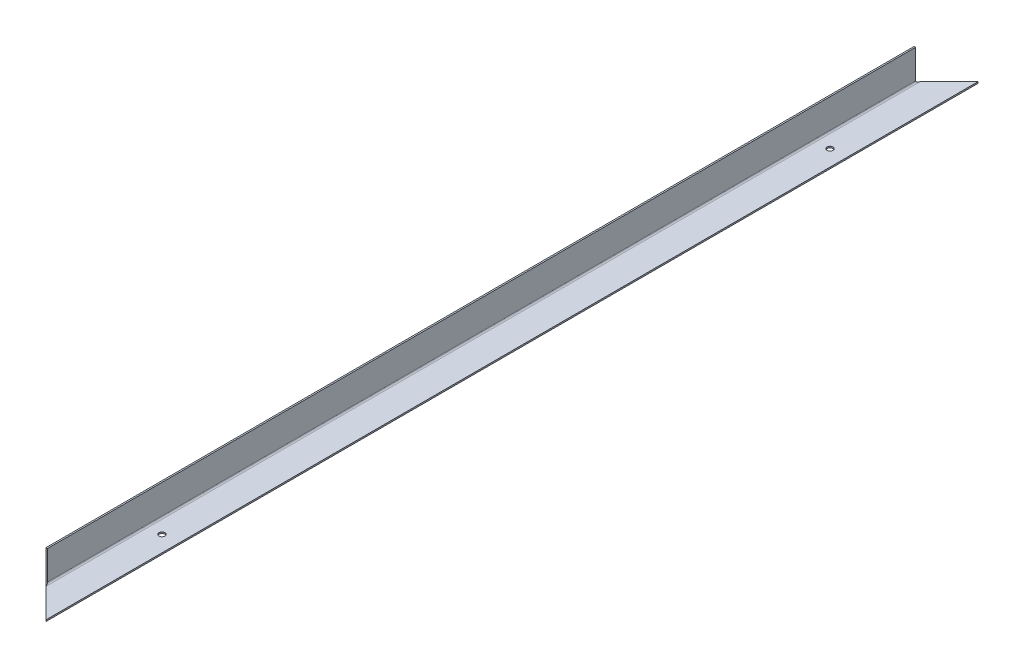
ISO-10303-21;
HEADER;
FILE_DESCRIPTION(('STEP AP214'),'2;1');
FILE_NAME('part.step','',(''),(''),'','','');
FILE_SCHEMA(('AUTOMOTIVE_DESIGN { 1 0 10303 214 1 1 1 1 }'));
ENDSEC;
DATA;
#1=APPLICATION_CONTEXT('core data for automotive mechanical design processes');
#2=APPLICATION_PROTOCOL_DEFINITION('international standard','automotive_design',2000,#1);
#3=PRODUCT_CONTEXT('',#1,'mechanical');
#4=PRODUCT('Part','Part','',(#3));
#5=PRODUCT_RELATED_PRODUCT_CATEGORY('part','',(#4));
#6=PRODUCT_DEFINITION_FORMATION('','',#4);
#7=PRODUCT_DEFINITION_CONTEXT('part definition',#1,'design');
#8=PRODUCT_DEFINITION('design','',#6,#7);
#9=PRODUCT_DEFINITION_SHAPE('','',#8);
#10=(LENGTH_UNIT() NAMED_UNIT(*) SI_UNIT(.MILLI.,.METRE.));
#11=(NAMED_UNIT(*) PLANE_ANGLE_UNIT() SI_UNIT($,.RADIAN.));
#12=(NAMED_UNIT(*) SI_UNIT($,.STERADIAN.) SOLID_ANGLE_UNIT());
#13=UNCERTAINTY_MEASURE_WITH_UNIT(LENGTH_MEASURE(1.E-05),#10,'distance_accuracy_value','');
#14=(GEOMETRIC_REPRESENTATION_CONTEXT(3) GLOBAL_UNCERTAINTY_ASSIGNED_CONTEXT((#13)) GLOBAL_UNIT_ASSIGNED_CONTEXT((#10,
#11,#12)) REPRESENTATION_CONTEXT('',''));
#15=CARTESIAN_POINT('',(0.,0.,0.));
#16=DIRECTION('',(0.,0.,1.));
#17=DIRECTION('',(1.,0.,0.));
#18=AXIS2_PLACEMENT_3D('',#15,#16,#17);
#19=CARTESIAN_POINT('',(9.525,0.,-1479.55));
#20=DIRECTION('',(0.,-1.,0.));
#21=DIRECTION('',(0.,0.,-1.));
#22=AXIS2_PLACEMENT_3D('',#19,#20,#21);
#23=PLANE('',#22);
#24=CARTESIAN_POINT('',(50.8,0.,-1060.45));
#25=DIRECTION('',(0.,1.,0.));
#26=DIRECTION('',(0.,0.,1.));
#27=AXIS2_PLACEMENT_3D('',#24,#25,#26);
#28=CIRCLE('',#27,9.52500000000001);
#29=CARTESIAN_POINT('',(50.8,0.,-1050.925));
#30=VERTEX_POINT('',#29);
#31=EDGE_CURVE('E10',#30,#30,#28,.T.);
#32=ORIENTED_EDGE('',*,*,#31,.T.);
#33=EDGE_LOOP('',(#32));
#34=FACE_BOUND('',#33,.T.);
#35=CARTESIAN_POINT('',(50.8,0.,1060.45));
#36=DIRECTION('',(0.,1.,0.));
#37=DIRECTION('',(0.,0.,1.));
#38=AXIS2_PLACEMENT_3D('',#35,#36,#37);
#39=CIRCLE('',#38,9.52500000000001);
#40=CARTESIAN_POINT('',(50.8,0.,1069.975));
#41=VERTEX_POINT('',#40);
#42=EDGE_CURVE('E32',#41,#41,#39,.T.);
#43=ORIENTED_EDGE('',*,*,#42,.T.);
#44=EDGE_LOOP('',(#43));
#45=FACE_BOUND('',#44,.T.);
#46=DIRECTION('',(-0.707106781186548,0.,-0.707106781186547));
#47=VECTOR('',#46,1.);
#48=CARTESIAN_POINT('',(101.6,0.,1479.55));
#49=LINE('',#48,#47);
#50=CARTESIAN_POINT('',(101.6,0.,1479.55));
#51=VERTEX_POINT('',#50);
#52=CARTESIAN_POINT('',(9.52500000000947,0.,1387.47499999999));
#53=VERTEX_POINT('',#52);
#54=EDGE_CURVE('E203',#51,#53,#49,.T.);
#55=ORIENTED_EDGE('',*,*,#54,.T.);
#56=DIRECTION('',(0.,0.,-1.));
#57=VECTOR('',#56,1.);
#58=CARTESIAN_POINT('',(9.525,0.,-1479.55));
#59=LINE('',#58,#57);
#60=CARTESIAN_POINT('',(9.52500000000845,0.,-1387.47499999999));
#61=VERTEX_POINT('',#60);
#62=EDGE_CURVE('E206',#53,#61,#59,.T.);
#63=ORIENTED_EDGE('',*,*,#62,.T.);
#64=DIRECTION('',(0.707106781186548,0.,-0.707106781186547));
#65=VECTOR('',#64,1.);
#66=CARTESIAN_POINT('',(9.525,0.,-1387.475));
#67=LINE('',#66,#65);
#68=CARTESIAN_POINT('',(101.6,0.,-1479.55));
#69=VERTEX_POINT('',#68);
#70=EDGE_CURVE('E211',#61,#69,#67,.T.);
#71=ORIENTED_EDGE('',*,*,#70,.T.);
#72=DIRECTION('',(0.,0.,1.));
#73=VECTOR('',#72,1.);
#74=CARTESIAN_POINT('',(101.6,0.,-1479.55));
#75=LINE('',#74,#73);
#76=EDGE_CURVE('E128',#69,#51,#75,.T.);
#77=ORIENTED_EDGE('',*,*,#76,.T.);
#78=EDGE_LOOP('',(#55,#63,#71,#77));
#79=FACE_BOUND('',#78,.T.);
#80=ADVANCED_FACE('F16',(#34,#45,#79),#23,.T.);
#81=CARTESIAN_POINT('',(50.8,-6.35,-1060.45));
#82=DIRECTION('',(0.,1.,0.));
#83=DIRECTION('',(0.,0.,1.));
#84=AXIS2_PLACEMENT_3D('',#81,#82,#83);
#85=CYLINDRICAL_SURFACE('',#84,9.52500000000001);
#86=CARTESIAN_POINT('',(50.8,4.7625,-1060.45));
#87=DIRECTION('',(0.,-1.,0.));
#88=DIRECTION('',(0.,0.,1.));
#89=AXIS2_PLACEMENT_3D('',#86,#87,#88);
#90=CIRCLE('',#89,9.52500000000001);
#91=CARTESIAN_POINT('',(50.8,4.7625,-1050.925));
#92=VERTEX_POINT('',#91);
#93=EDGE_CURVE('E118',#92,#92,#90,.T.);
#94=ORIENTED_EDGE('',*,*,#93,.F.);
#95=EDGE_LOOP('',(#94));
#96=FACE_BOUND('',#95,.T.);
#97=ORIENTED_EDGE('',*,*,#31,.F.);
#98=EDGE_LOOP('',(#97));
#99=FACE_BOUND('',#98,.T.);
#100=ADVANCED_FACE('F180',(#96,#99),#85,.F.);
#101=CARTESIAN_POINT('',(50.8,-6.35,1060.45));
#102=DIRECTION('',(0.,1.,0.));
#103=DIRECTION('',(0.,0.,1.));
#104=AXIS2_PLACEMENT_3D('',#101,#102,#103);
#105=CYLINDRICAL_SURFACE('',#104,9.52500000000001);
#106=CARTESIAN_POINT('',(50.8,4.7625,1060.45));
#107=DIRECTION('',(0.,-1.,0.));
#108=DIRECTION('',(0.,0.,1.));
#109=AXIS2_PLACEMENT_3D('',#106,#107,#108);
#110=CIRCLE('',#109,9.52500000000001);
#111=CARTESIAN_POINT('',(50.8,4.7625,1069.975));
#112=VERTEX_POINT('',#111);
#113=EDGE_CURVE('E200',#112,#112,#110,.T.);
#114=ORIENTED_EDGE('',*,*,#113,.F.);
#115=EDGE_LOOP('',(#114));
#116=FACE_BOUND('',#115,.T.);
#117=ORIENTED_EDGE('',*,*,#42,.F.);
#118=EDGE_LOOP('',(#117));
#119=FACE_BOUND('',#118,.T.);
#120=ADVANCED_FACE('F186',(#116,#119),#105,.F.);
#121=CARTESIAN_POINT('',(9.525,9.525,-1479.55));
#122=DIRECTION('',(0.,0.,1.));
#123=DIRECTION('',(1.,0.,0.));
#124=AXIS2_PLACEMENT_3D('',#121,#122,#123);
#125=CYLINDRICAL_SURFACE('',#124,9.525);
#126=CARTESIAN_POINT('',(9.52500000001893,0.,1387.47499999998));
#127=CARTESIAN_POINT('',(9.28049347660746,2.05634953961424E-05,1387.23049815825));
#128=CARTESIAN_POINT('',(9.03598477268124,0.00941578356025565,1386.98598321547));
#129=CARTESIAN_POINT('',(8.54735623327488,0.0471271371235056,1386.49733674944));
#130=CARTESIAN_POINT('',(8.30323743189529,0.0754699249693447,1386.25320625263));
#131=CARTESIAN_POINT('',(7.81634132393537,0.15126969460795,1385.76629777302));
#132=CARTESIAN_POINT('',(7.57356483083965,0.198737202160602,1385.52352060979));
#133=CARTESIAN_POINT('',(7.08785597304547,0.313655643724657,1385.03783295466));
#134=CARTESIAN_POINT('',(6.84494664195129,0.381302935109063,1384.79494572336));
#135=CARTESIAN_POINT('',(6.36250109714271,0.53676161587531,1384.31250231793));
#136=CARTESIAN_POINT('',(6.12296341578366,0.624563924568335,1384.07294469505));
#137=CARTESIAN_POINT('',(5.64826975756451,0.82083288362917,1383.5981896884));
#138=CARTESIAN_POINT('',(5.41311190629875,0.929290460339296,1383.36299043963));
#139=CARTESIAN_POINT('',(4.94025201261949,1.17163578380016,1382.89009332176));
#140=CARTESIAN_POINT('',(4.70273888416037,1.30626754856149,1382.65258597667));
#141=CARTESIAN_POINT('',(4.2350658545032,1.59919755561935,1382.18498059512));
#142=CARTESIAN_POINT('',(4.004905908177,1.7574956526364,1381.95488251319));
#143=CARTESIAN_POINT('',(3.55457905295541,2.0980788939411,1381.50460028697));
#144=CARTESIAN_POINT('',(3.33438281118656,2.2802865028533,1381.28438705965));
#145=CARTESIAN_POINT('',(2.90548885504568,2.66995775122002,1380.85539317235));
#146=CARTESIAN_POINT('',(2.69678791333513,2.87741424893502,1380.64660930365));
#147=CARTESIAN_POINT('',(2.34507198114004,3.26211226666419,1380.29479305743));
#148=CARTESIAN_POINT('',(2.19888523234899,3.43355506337482,1380.14857759705));
#149=CARTESIAN_POINT('',(1.91572342154318,3.79119291645837,1379.86550699556));
#150=CARTESIAN_POINT('',(1.77874766631356,3.97738686036474,1379.72865115004));
#151=CARTESIAN_POINT('',(1.51565032137188,4.36450848674882,1379.46599835823));
#152=CARTESIAN_POINT('',(1.38952317855793,4.56542853261422,1379.34019575337));
#153=CARTESIAN_POINT('',(1.14991806413451,4.9817324426683,1379.10105684293));
#154=CARTESIAN_POINT('',(1.03643774273252,5.19711360800892,1378.98771822158));
#155=CARTESIAN_POINT('',(0.845761289729109,5.59627486524465,1378.79700286239));
#156=CARTESIAN_POINT('',(0.765887321621808,5.7775296243926,1378.71700818217));
#157=CARTESIAN_POINT('',(0.616391882277277,6.14827625449851,1378.56710412673));
#158=CARTESIAN_POINT('',(0.54676960702547,6.33776747797988,1378.49719396062));
#159=CARTESIAN_POINT('',(0.418916868141071,6.72390182705401,1378.3688773557));
#160=CARTESIAN_POINT('',(0.360664136438431,6.92053005949841,1378.3104484285));
#161=CARTESIAN_POINT('',(0.25638884689196,7.32021175474631,1378.20599083632));
#162=CARTESIAN_POINT('',(0.21036340760089,7.52326369111436,1378.15995924979));
#163=CARTESIAN_POINT('',(0.142863340972992,7.87477325513757,1378.09250590674));
#164=CARTESIAN_POINT('',(0.118139430330909,8.02199505069567,1378.06781827611));
#165=CARTESIAN_POINT('',(0.075549052405882,8.3183894845864,1378.02531265166));
#166=CARTESIAN_POINT('',(0.0576811323728245,8.46756170269912,1378.00749320249));
#167=CARTESIAN_POINT('',(0.0289500058449694,8.76773679759981,1377.97884784681));
#168=CARTESIAN_POINT('',(0.0181095572068952,8.91874402455885,1377.96804466164));
#169=CARTESIAN_POINT('',(0.00362617677232511,9.22149827303051,1377.9536133557));
#170=CARTESIAN_POINT('',(-1.41740801134775E-05,9.37324554028516,1377.94998780782));
#171=CARTESIAN_POINT('',(0.,9.52499999999996,1377.95000000002));
#172=B_SPLINE_CURVE_WITH_KNOTS('',3,(#126,#127,#128,#129,#130,#131,#132,#133,#134,#135,#136,
#137,#138,#139,#140,#141,#142,#143,#144,#145,#146,#147,#148,#149,#150,#151,#152,#153,#154,#155,
#156,#157,#158,#159,#160,#161,#162,#163,#164,#165,#166,#167,#168,#169,#170,#171),.UNSPECIFIED.,
.F.,.F.,(4,2,2,2,2,2,2,2,2,2,2,2,2,2,2,2,2,2,2,2,2,2,4),(0.,1.03723359166786,2.07592938286437,
3.11519762846567,4.16492790288538,5.21418615441553,6.26298453581872,7.34771954008274,
8.43244788580417,9.51374173529114,10.5947304446229,11.399871436145,12.2049517651753,
13.0096175127008,13.8141335023573,14.4544046519348,15.0946255598743,15.7335796810601,
16.3723830943888,16.8260193635493,17.2795594563009,17.7345610576563,18.1897257291582),.UNSPECIFIED.);
#173=CARTESIAN_POINT('',(0.,9.525,1377.95000000001));
#174=VERTEX_POINT('',#173);
#175=EDGE_CURVE('E41',#53,#174,#172,.T.);
#176=ORIENTED_EDGE('',*,*,#175,.T.);
#177=DIRECTION('',(0.,0.,-1.));
#178=VECTOR('',#177,1.);
#179=CARTESIAN_POINT('',(0.,9.525,-1479.55));
#180=LINE('',#179,#178);
#181=CARTESIAN_POINT('',(0.,9.525,-1377.95000000001));
#182=VERTEX_POINT('',#181);
#183=EDGE_CURVE('E129',#174,#182,#180,.T.);
#184=ORIENTED_EDGE('',*,*,#183,.T.);
#185=CARTESIAN_POINT('',(0.,9.525,-1377.95000000002));
#186=CARTESIAN_POINT('',(-9.91589461548578E-07,9.42915150683353,-1377.94999929035));
#187=CARTESIAN_POINT('',(0.00144711344574631,9.33331497239321,-1377.9514419854));
#188=CARTESIAN_POINT('',(0.00722866095605202,9.14181831632707,-1377.9572026371));
#189=CARTESIAN_POINT('',(0.0115620167332816,9.04615818948706,-1377.96152050734));
#190=CARTESIAN_POINT('',(0.0288629704361846,8.75979224394341,-1377.97876187928));
#191=CARTESIAN_POINT('',(0.0461314908465066,8.56957024289112,-1377.99597317515));
#192=CARTESIAN_POINT('',(0.0916903829538268,8.19306888499282,-1378.04141746216));
#193=CARTESIAN_POINT('',(0.119909553969912,8.00677209295464,-1378.06957925595));
#194=CARTESIAN_POINT('',(0.186904947675048,7.63801170620039,-1378.13651000596));
#195=CARTESIAN_POINT('',(0.22568202094542,7.45554842160133,-1378.17527981678));
#196=CARTESIAN_POINT('',(0.31390704838414,7.0925412551736,-1378.26359322956));
#197=CARTESIAN_POINT('',(0.363519899908239,6.91207819993196,-1378.3133034221));
#198=CARTESIAN_POINT('',(0.47228982838094,6.55708201132234,-1378.42242599751));
#199=CARTESIAN_POINT('',(0.531446851203861,6.38254884433232,-1378.48183832535));
#200=CARTESIAN_POINT('',(0.658658917135603,6.0397307238677,-1378.60949862282));
#201=CARTESIAN_POINT('',(0.726728565633069,5.8714566215571,-1378.67776109359));
#202=CARTESIAN_POINT('',(0.870931174920256,5.54190017125643,-1378.82218841967));
#203=CARTESIAN_POINT('',(0.947065321096725,5.38061885604805,-1378.89835443667));
#204=CARTESIAN_POINT('',(1.14352950413711,4.99253136154765,-1379.09469364105));
#205=CARTESIAN_POINT('',(1.26802825412687,4.76987534563031,-1379.21894155505));
#206=CARTESIAN_POINT('',(1.53039782136086,4.34086688495749,-1379.48075734466));
#207=CARTESIAN_POINT('',(1.66827301697529,4.13451981881505,-1379.61832958156));
#208=CARTESIAN_POINT('',(1.95547520219099,3.7381255685942,-1379.90520446456));
#209=CARTESIAN_POINT('',(2.1048171978038,3.54810045726637,-1380.05452248826));
#210=CARTESIAN_POINT('',(2.41307415133647,3.18441935551679,-1380.36280773926));
#211=CARTESIAN_POINT('',(2.57198959626799,3.01076419900678,-1380.52177545745));
#212=CARTESIAN_POINT('',(2.96049666057888,2.61585003433372,-1380.91040999055));
#213=CARTESIAN_POINT('',(3.19380909151124,2.40189393407864,-1381.1437987159));
#214=CARTESIAN_POINT('',(3.67275286568003,2.0034368145113,-1381.62277311792));
#215=CARTESIAN_POINT('',(3.91838864089748,1.81894649355269,-1381.86836318237));
#216=CARTESIAN_POINT('',(4.41993376861955,1.47788037104338,-1382.36982312786));
#217=CARTESIAN_POINT('',(4.67586894896263,1.32138089561406,-1382.62571885383));
#218=CARTESIAN_POINT('',(5.19519374218352,1.0358179648721,-1383.14504302717));
#219=CARTESIAN_POINT('',(5.458582820293,0.906752546971444,-1383.40847093418));
#220=CARTESIAN_POINT('',(5.93044977742306,0.701445579913521,-1383.88040746624));
#221=CARTESIAN_POINT('',(6.13778070216222,0.619867200203066,-1384.08776896517));
#222=CARTESIAN_POINT('',(6.55522119118006,0.472096295649559,-1384.50522816881));
#223=CARTESIAN_POINT('',(6.76533116250709,0.405906051690953,-1384.7153262743));
#224=CARTESIAN_POINT('',(7.18768406182995,0.288624839461381,-1385.13765657219));
#225=CARTESIAN_POINT('',(7.39992741090874,0.237536915075787,-1385.34988918591));
#226=CARTESIAN_POINT('',(7.82399529585943,0.150640115883992,-1385.77395152276));
#227=CARTESIAN_POINT('',(8.03580616766461,0.114696852281686,-1385.98576743828));
#228=CARTESIAN_POINT('',(8.46034515822263,0.0572641354881007,-1386.41032107877));
#229=CARTESIAN_POINT('',(8.67307302497781,0.0357709380477127,-1386.62305855057));
#230=CARTESIAN_POINT('',(9.09886745871694,0.00714974977937775,-1387.04886677162));
#231=CARTESIAN_POINT('',(9.3119336902806,1.18472766825181E-05,-1387.26193718919));
#232=CARTESIAN_POINT('',(9.5250000000169,0.,-1387.47499999998));
#233=B_SPLINE_CURVE_WITH_KNOTS('',3,(#185,#186,#187,#188,#189,#190,#191,#192,#193,#194,#195,
#196,#197,#198,#199,#200,#201,#202,#203,#204,#205,#206,#207,#208,#209,#210,#211,#212,#213,#214,
#215,#216,#217,#218,#219,#220,#221,#222,#223,#224,#225,#226,#227,#228,#229,#230,#231,#232),
.UNSPECIFIED.,.F.,.F.,(4,2,2,2,2,2,2,2,2,2,2,2,2,2,2,2,2,2,2,2,2,2,2,4),(0.,0.287500019615309,
0.574991400635147,1.1495835910347,1.72050076719442,2.29146395204386,2.87181064177892,
3.4521540404419,4.03346065495526,4.61485283361791,5.46483511879003,6.31509656437161,
7.16649031606875,8.01792741571631,9.19608086435981,10.3746611060199,11.5564076950861,
12.7380697154425,13.6507722701733,14.563610022807,15.4766316334227,16.381371466292,
17.2858767757872,18.1897573510224),.UNSPECIFIED.);
#234=EDGE_CURVE('E130',#182,#61,#233,.T.);
#235=ORIENTED_EDGE('',*,*,#234,.T.);
#236=ORIENTED_EDGE('',*,*,#62,.F.);
#237=EDGE_LOOP('',(#176,#184,#235,#236));
#238=FACE_BOUND('',#237,.T.);
#239=ADVANCED_FACE('F135',(#238),#125,.T.);
#240=CARTESIAN_POINT('',(55.5625,2.38125,1433.5125));
#241=DIRECTION('',(-0.707106781186548,0.,0.707106781186548));
#242=DIRECTION('',(0.707106781186548,0.,0.707106781186548));
#243=AXIS2_PLACEMENT_3D('',#240,#241,#242);
#244=PLANE('',#243);
#245=DIRECTION('',(0.,-1.,0.));
#246=VECTOR('',#245,1.);
#247=CARTESIAN_POINT('',(9.52500000000003,2.38125,1387.475));
#248=LINE('',#247,#246);
#249=CARTESIAN_POINT('',(9.5250000000001,4.7625,1387.475));
#250=VERTEX_POINT('',#249);
#251=EDGE_CURVE('E219',#250,#53,#248,.T.);
#252=ORIENTED_EDGE('',*,*,#251,.T.);
#253=ORIENTED_EDGE('',*,*,#54,.F.);
#254=DIRECTION('',(0.,1.,0.));
#255=VECTOR('',#254,1.);
#256=CARTESIAN_POINT('',(101.6,2.38125,1479.55));
#257=LINE('',#256,#255);
#258=CARTESIAN_POINT('',(101.6,4.7625,1479.55));
#259=VERTEX_POINT('',#258);
#260=EDGE_CURVE('E216',#51,#259,#257,.T.);
#261=ORIENTED_EDGE('',*,*,#260,.T.);
#262=DIRECTION('',(-0.707106781186548,0.,-0.707106781186548));
#263=VECTOR('',#262,1.);
#264=CARTESIAN_POINT('',(55.5625,4.7625,1433.5125));
#265=LINE('',#264,#263);
#266=EDGE_CURVE('E220',#259,#250,#265,.T.);
#267=ORIENTED_EDGE('',*,*,#266,.T.);
#268=EDGE_LOOP('',(#252,#253,#261,#267));
#269=FACE_BOUND('',#268,.T.);
#270=ADVANCED_FACE('F195',(#269),#244,.T.);
#271=CARTESIAN_POINT('',(101.6,2.38125,0.));
#272=DIRECTION('',(1.,0.,0.));
#273=DIRECTION('',(0.,0.,-1.));
#274=AXIS2_PLACEMENT_3D('',#271,#272,#273);
#275=PLANE('',#274);
#276=ORIENTED_EDGE('',*,*,#260,.F.);
#277=ORIENTED_EDGE('',*,*,#76,.F.);
#278=DIRECTION('',(0.,1.,0.));
#279=VECTOR('',#278,1.);
#280=CARTESIAN_POINT('',(101.6,2.38125,-1479.55));
#281=LINE('',#280,#279);
#282=CARTESIAN_POINT('',(101.6,4.7625,-1479.55));
#283=VERTEX_POINT('',#282);
#284=EDGE_CURVE('E221',#69,#283,#281,.T.);
#285=ORIENTED_EDGE('',*,*,#284,.T.);
#286=DIRECTION('',(0.,0.,1.));
#287=VECTOR('',#286,1.);
#288=CARTESIAN_POINT('',(101.6,4.7625,0.));
#289=LINE('',#288,#287);
#290=EDGE_CURVE('E224',#283,#259,#289,.T.);
#291=ORIENTED_EDGE('',*,*,#290,.T.);
#292=EDGE_LOOP('',(#276,#277,#285,#291));
#293=FACE_BOUND('',#292,.T.);
#294=ADVANCED_FACE('F262',(#293),#275,.T.);
#295=CARTESIAN_POINT('',(55.5625,2.38125,-1433.5125));
#296=DIRECTION('',(-0.707106781186548,0.,-0.707106781186548));
#297=DIRECTION('',(-0.707106781186548,0.,0.707106781186548));
#298=AXIS2_PLACEMENT_3D('',#295,#296,#297);
#299=PLANE('',#298);
#300=ORIENTED_EDGE('',*,*,#284,.F.);
#301=ORIENTED_EDGE('',*,*,#70,.F.);
#302=DIRECTION('',(0.,1.,0.));
#303=VECTOR('',#302,1.);
#304=CARTESIAN_POINT('',(9.52500000000003,2.38125,-1387.475));
#305=LINE('',#304,#303);
#306=CARTESIAN_POINT('',(9.52500000000002,4.7625,-1387.475));
#307=VERTEX_POINT('',#306);
#308=EDGE_CURVE('E117',#61,#307,#305,.T.);
#309=ORIENTED_EDGE('',*,*,#308,.T.);
#310=DIRECTION('',(0.707106781186548,0.,-0.707106781186548));
#311=VECTOR('',#310,1.);
#312=CARTESIAN_POINT('',(55.5625,4.7625,-1433.5125));
#313=LINE('',#312,#311);
#314=EDGE_CURVE('E114',#307,#283,#313,.T.);
#315=ORIENTED_EDGE('',*,*,#314,.T.);
#316=EDGE_LOOP('',(#300,#301,#309,#315));
#317=FACE_BOUND('',#316,.T.);
#318=ADVANCED_FACE('F266',(#317),#299,.T.);
#319=CARTESIAN_POINT('',(9.525,4.7625,-1479.55));
#320=DIRECTION('',(0.,-1.,0.));
#321=DIRECTION('',(0.,0.,-1.));
#322=AXIS2_PLACEMENT_3D('',#319,#320,#321);
#323=PLANE('',#322);
#324=ORIENTED_EDGE('',*,*,#93,.T.);
#325=EDGE_LOOP('',(#324));
#326=FACE_BOUND('',#325,.T.);
#327=ORIENTED_EDGE('',*,*,#113,.T.);
#328=EDGE_LOOP('',(#327));
#329=FACE_BOUND('',#328,.T.);
#330=ORIENTED_EDGE('',*,*,#290,.F.);
#331=ORIENTED_EDGE('',*,*,#314,.F.);
#332=DIRECTION('',(0.,0.,-1.));
#333=VECTOR('',#332,1.);
#334=CARTESIAN_POINT('',(9.525,4.7625,-1479.55));
#335=LINE('',#334,#333);
#336=EDGE_CURVE('E71',#250,#307,#335,.T.);
#337=ORIENTED_EDGE('',*,*,#336,.F.);
#338=ORIENTED_EDGE('',*,*,#266,.F.);
#339=EDGE_LOOP('',(#330,#331,#337,#338));
#340=FACE_BOUND('',#339,.T.);
#341=ADVANCED_FACE('F264',(#326,#329,#340),#323,.F.);
#342=CARTESIAN_POINT('',(0.,101.6,-1479.55));
#343=DIRECTION('',(-1.,0.,0.));
#344=DIRECTION('',(0.,0.,1.));
#345=AXIS2_PLACEMENT_3D('',#342,#343,#344);
#346=PLANE('',#345);
#347=DIRECTION('',(0.,1.,0.));
#348=VECTOR('',#347,1.);
#349=CARTESIAN_POINT('',(0.,101.6,1377.95));
#350=LINE('',#349,#348);
#351=CARTESIAN_POINT('',(0.,101.6,1377.95));
#352=VERTEX_POINT('',#351);
#353=EDGE_CURVE('E215',#174,#352,#350,.T.);
#354=ORIENTED_EDGE('',*,*,#353,.T.);
#355=DIRECTION('',(0.,0.,-1.));
#356=VECTOR('',#355,1.);
#357=CARTESIAN_POINT('',(0.,101.6,-1479.55));
#358=LINE('',#357,#356);
#359=CARTESIAN_POINT('',(0.,101.6,-1377.95));
#360=VERTEX_POINT('',#359);
#361=EDGE_CURVE('E81',#352,#360,#358,.T.);
#362=ORIENTED_EDGE('',*,*,#361,.T.);
#363=DIRECTION('',(0.,-1.,0.));
#364=VECTOR('',#363,1.);
#365=CARTESIAN_POINT('',(0.,101.6,-1377.95));
#366=LINE('',#365,#364);
#367=EDGE_CURVE('E227',#360,#182,#366,.T.);
#368=ORIENTED_EDGE('',*,*,#367,.T.);
#369=ORIENTED_EDGE('',*,*,#183,.F.);
#370=EDGE_LOOP('',(#354,#362,#368,#369));
#371=FACE_BOUND('',#370,.T.);
#372=ADVANCED_FACE('F146',(#371),#346,.T.);
#373=CARTESIAN_POINT('',(-2.05669195877423,15.5516188952471,1379.04131073178));
#374=CARTESIAN_POINT('',(1.44759137960927,13.7281391949951,1379.04131073178));
#375=CARTESIAN_POINT('',(4.95187471799352,11.9046594947431,1379.04131073178));
#376=CARTESIAN_POINT('',(8.45615805637498,10.0811797944911,1379.04131073178));
#377=CARTESIAN_POINT('',(-3.0360629163939,13.7457953734013,1378.32814115659));
#378=CARTESIAN_POINT('',(0.76454960611109,12.4687053804718,1378.32814115659));
#379=CARTESIAN_POINT('',(4.56516212861608,11.1916153875423,1378.32814115659));
#380=CARTESIAN_POINT('',(8.3657746511198,9.91452539461542,1378.32814115659));
#381=CARTESIAN_POINT('',(-3.87144690120298,10.3851165093876,1377.71982166635));
#382=CARTESIAN_POINT('',(0.181928532760673,10.1248702548977,1377.71982166635));
#383=CARTESIAN_POINT('',(4.23530396672336,9.86462400041028,1377.71982166635));
#384=CARTESIAN_POINT('',(8.28867940068526,9.60437774592034,1377.71982166635));
#385=CARTESIAN_POINT('',(-3.1705294913388,5.60052196470456,1378.23022374384));
#386=CARTESIAN_POINT('',(0.67076870816526,6.78795494426362,1378.23022374384));
#387=CARTESIAN_POINT('',(4.51206690766932,7.97538792382268,1378.23022374384));
#388=CARTESIAN_POINT('',(8.35336510717338,9.16282090338174,1378.23022374384));
#389=CARTESIAN_POINT('',(-1.3587123405168,1.89082501148694,1379.5495735344));
#390=CARTESIAN_POINT('',(1.93438265375426,4.20070445826948,1379.5495735344));
#391=CARTESIAN_POINT('',(5.22747764802608,6.51058390505456,1379.5495735344));
#392=CARTESIAN_POINT('',(8.5205726422979,8.8204633518371,1379.5495735344));
#393=CARTESIAN_POINT('',(1.48870157994979,-1.06085476971929,1381.62303605701));
#394=CARTESIAN_POINT('',(3.92025188847978,2.14211718153939,1381.62303605701));
#395=CARTESIAN_POINT('',(6.35180219701028,5.34508913279756,1381.62303605701));
#396=CARTESIAN_POINT('',(8.78335250554078,8.548061084057,1381.62303605701));
#397=CARTESIAN_POINT('',(5.13509285557734,-3.03457189155528,1384.2783070726));
#398=CARTESIAN_POINT('',(6.46335115479838,0.765589490173558,1384.2783070726));
#399=CARTESIAN_POINT('',(7.79160945401688,4.56575087190138,1384.2783070726));
#400=CARTESIAN_POINT('',(9.11986775323792,8.36591225362844,1384.2783070726));
#401=CARTESIAN_POINT('',(9.29310954339068,-3.78738687249584,1387.30613934788));
#402=CARTESIAN_POINT('',(9.36327285513388,0.240554440177584,1387.30613934788));
#403=CARTESIAN_POINT('',(9.43343616687962,4.26849575285172,1387.30613934788));
#404=CARTESIAN_POINT('',(9.50359947862282,8.29643706552296,1387.30613934788));
#405=CARTESIAN_POINT('',(12.2821595376435,-3.34858141188906,1389.48274005106));
#406=CARTESIAN_POINT('',(11.4479232046945,0.546590123288738,1389.48274005106));
#407=CARTESIAN_POINT('',(10.6136868717456,4.44176165846552,1389.48274005106));
#408=CARTESIAN_POINT('',(9.77945053879666,8.33693319364154,1389.48274005106));
#409=CARTESIAN_POINT('',(13.7248766066689,-2.89143109868326,1390.53331431135));
#410=CARTESIAN_POINT('',(12.454116024502,0.865420039836926,1390.53331431135));
#411=CARTESIAN_POINT('',(11.1833554423351,4.62227117835508,1390.53331431135));
#412=CARTESIAN_POINT('',(9.9125948601656,8.37912231687552,1390.53331431135));
#413=B_SPLINE_SURFACE_WITH_KNOTS('',3,3,((#373,#374,#375,#376),(#377,#378,#379,#380),(#381,#382,
#383,#384),(#385,#386,#387,#388),(#389,#390,#391,#392),(#393,#394,#395,#396),(#397,#398,#399,
#400),(#401,#402,#403,#404),(#405,#406,#407,#408),(#409,#410,#411,#412)),.UNSPECIFIED.,.F.,.F.,
.F.,(4,1,1,1,1,1,1,4),(4,4),(-0.3285636405851,0.,0.2,0.4,0.6,0.8,1.,1.178222098057),
(-0.7465303950322,1.746530395032),.UNSPECIFIED.);
#414=DIRECTION('',(-1.,1.06071575486866E-13,0.));
#415=VECTOR('',#414,1.);
#416=CARTESIAN_POINT('',(2.38124999999983,9.52499999999975,1377.95000000002));
#417=LINE('',#416,#415);
#418=CARTESIAN_POINT('',(4.7625,9.52499999999987,1377.95000000001));
#419=VERTEX_POINT('',#418);
#420=EDGE_CURVE('E109',#419,#174,#417,.T.);
#421=CARTESIAN_POINT('',(9.52500000001514,4.7625,1387.47499999999));
#422=CARTESIAN_POINT('',(9.40979215956903,4.76251816260421,1387.2445884438));
#423=CARTESIAN_POINT('',(9.29458613868149,4.7666812808287,1387.01417115099));
#424=CARTESIAN_POINT('',(9.06398534547455,4.78344756418494,1386.5529534929));
#425=CARTESIAN_POINT('',(8.94859091391688,4.79607369048795,1386.32215379401));
#426=CARTESIAN_POINT('',(8.71786434482182,4.82994472279412,1385.86068670692));
#427=CARTESIAN_POINT('',(8.60253260666766,4.85120347182901,1385.63002012996));
#428=CARTESIAN_POINT('',(8.37218636231023,4.90262346331749,1385.16934251479));
#429=CARTESIAN_POINT('',(8.25717208868529,4.93279005363095,1384.93933195442));
#430=CARTESIAN_POINT('',(8.02825305747241,5.00223593710902,1384.48150798729));
#431=CARTESIAN_POINT('',(7.91434562554911,5.04147163915579,1384.25368933451));
#432=CARTESIAN_POINT('',(7.68736725840811,5.12962409476753,1383.79968667285));
#433=CARTESIAN_POINT('',(7.57429584190255,5.17853474065022,1383.57350172552));
#434=CARTESIAN_POINT('',(7.34923246558475,5.28671969649636,1383.12331920535));
#435=CARTESIAN_POINT('',(7.2372396787403,5.34598526562782,1382.89931995457));
#436=CARTESIAN_POINT('',(7.01460556596469,5.4758110459379,1382.45408058808));
#437=CARTESIAN_POINT('',(6.90396347453819,5.54636450626553,1382.23283890791));
#438=CARTESIAN_POINT('',(6.72625039168386,5.67074580367866,1381.87747813698));
#439=CARTESIAN_POINT('',(6.65863537578353,5.72070844922802,1381.74227230054));
#440=CARTESIAN_POINT('',(6.52422516952172,5.82580571957032,1381.47346622379));
#441=CARTESIAN_POINT('',(6.45742996631605,5.88094026321667,1381.3398659583));
#442=CARTESIAN_POINT('',(6.32451163182145,5.99709563590856,1381.07398227043));
#443=CARTESIAN_POINT('',(6.25839320865112,6.0581432165695,1380.94170813464));
#444=CARTESIAN_POINT('',(6.12737030901557,6.18644885242138,1380.67958019836));
#445=CARTESIAN_POINT('',(6.06246585696205,6.25370703233992,1380.54972644656));
#446=CARTESIAN_POINT('',(5.91603581018963,6.41504906284274,1380.25678143888));
#447=CARTESIAN_POINT('',(5.83499095599248,6.51134552975863,1380.09465658852));
#448=CARTESIAN_POINT('',(5.67608466503473,6.71712166219473,1379.77702366815));
#449=CARTESIAN_POINT('',(5.59822553642353,6.82661066719802,1379.62152039247));
#450=CARTESIAN_POINT('',(5.4851737786197,7.00190946794224,1379.39587369311));
#451=CARTESIAN_POINT('',(5.44821966492844,7.06198688927788,1379.32213939622));
#452=CARTESIAN_POINT('',(5.37572260073749,7.18618021589787,1379.17744094572));
#453=CARTESIAN_POINT('',(5.34017935016594,7.25029525484986,1379.10647620312));
#454=CARTESIAN_POINT('',(5.27084511213651,7.38276950765667,1378.9679509257));
#455=CARTESIAN_POINT('',(5.23705143642444,7.4511218328538,1378.90038517308));
#456=CARTESIAN_POINT('',(5.17151741640017,7.59247170642018,1378.76922913687));
#457=CARTESIAN_POINT('',(5.13977670317319,7.66546841549652,1378.70563813908));
#458=CARTESIAN_POINT('',(5.08633872502241,7.79773687884442,1378.59847881919));
#459=CARTESIAN_POINT('',(5.06410117222054,7.85592951644463,1378.55385255193));
#460=CARTESIAN_POINT('',(5.02126013299691,7.97523869613654,1378.4678487258));
#461=CARTESIAN_POINT('',(5.00065693031546,8.03635574299642,1378.42647173106));
#462=CARTESIAN_POINT('',(4.94165532831294,8.22439274176784,1378.3080661479));
#463=CARTESIAN_POINT('',(4.90605633172798,8.35601928802951,1378.23674565101));
#464=CARTESIAN_POINT('',(4.86011976675027,8.56301733527747,1378.14484292055));
#465=CARTESIAN_POINT('',(4.8459713122745,8.63420051222757,1378.11656258347));
#466=CARTESIAN_POINT('',(4.8206858742109,8.77918632105906,1378.06605179966));
#467=CARTESIAN_POINT('',(4.80954697702562,8.85298725452984,1378.04381750855));
#468=CARTESIAN_POINT('',(4.79065247730722,9.00248577290111,1378.00611919599));
#469=CARTESIAN_POINT('',(4.78288674477235,9.07817694689882,1377.99063490302));
#470=CARTESIAN_POINT('',(4.77097245712851,9.23092159814414,1377.96688364596));
#471=CARTESIAN_POINT('',(4.76682025938147,9.30797362342635,1377.95860941373));
#472=CARTESIAN_POINT('',(4.76386729839359,9.40852547457196,1377.95272480305));
#473=CARTESIAN_POINT('',(4.76335462599269,9.43181350923354,1377.9517031403));
#474=CARTESIAN_POINT('',(4.76267116812395,9.47839977005076,1377.95034112068));
#475=CARTESIAN_POINT('',(4.76250016679465,9.5016979804643,1377.95000033365));
#476=CARTESIAN_POINT('',(4.7625,9.52499999999978,1377.95000000002));
#477=B_SPLINE_CURVE_WITH_KNOTS('',3,(#421,#422,#423,#424,#425,#426,#427,#428,#429,#430,#431,
#432,#433,#434,#435,#436,#437,#438,#439,#440,#441,#442,#443,#444,#445,#446,#447,#448,#449,#450,
#451,#452,#453,#454,#455,#456,#457,#458,#459,#460,#461,#462,#463,#464,#465,#466,#467,#468,#469,
#470,#471,#472,#473,#474,#475,#476),.UNSPECIFIED.,.F.,.F.,(4,2,2,2,2,2,2,2,2,2,2,2,2,2,2,2,2,2,
2,2,2,2,2,2,2,2,2,4),(0.,0.77280003264993,1.547705298787,2.32385811945754,3.10047785738855,
3.87343962802507,4.64591498506047,5.41774140046887,6.18910793009891,6.66666623995454,
7.14421705821709,7.62403942522876,8.10387143062095,8.71917054872587,9.33490784765013,
9.64091712221076,9.94686096006761,10.2523198377936,10.5577236715575,10.7874782444797,
11.0172726182997,11.4767768922558,11.7101814961735,11.9434373409311,12.1759877652008,
12.4083034936493,12.4782430439698,12.5481383937884),.UNSPECIFIED.);
#478=EDGE_CURVE('E157',#250,#419,#477,.T.);
#479=ORIENTED_EDGE('',*,*,#420,.T.);
#480=ORIENTED_EDGE('',*,*,#175,.F.);
#481=ORIENTED_EDGE('',*,*,#251,.F.);
#482=ORIENTED_EDGE('',*,*,#478,.T.);
#483=EDGE_LOOP('',(#479,#480,#481,#482));
#484=FACE_BOUND('',#483,.T.);
#485=ADVANCED_FACE('F139',(#484),#413,.T.);
#486=CARTESIAN_POINT('',(-2.05669195877372,15.5516188952471,-1379.04131073178));
#487=CARTESIAN_POINT('',(1.44759137960952,13.7281391949951,-1379.04131073178));
#488=CARTESIAN_POINT('',(4.95187471799352,11.9046594947431,-1379.04131073178));
#489=CARTESIAN_POINT('',(8.45615805637498,10.0811797944911,-1379.04131073178));
#490=CARTESIAN_POINT('',(-3.0360629163939,13.7457953734013,-1378.32814115659));
#491=CARTESIAN_POINT('',(0.76454960611109,12.4687053804718,-1378.32814115659));
#492=CARTESIAN_POINT('',(4.56516212861608,11.1916153875423,-1378.32814115659));
#493=CARTESIAN_POINT('',(8.3657746511198,9.91452539461542,-1378.32814115659));
#494=CARTESIAN_POINT('',(-3.87144690120298,10.3851165093876,-1377.71982166635));
#495=CARTESIAN_POINT('',(0.181928532760647,10.1248702548977,-1377.71982166635));
#496=CARTESIAN_POINT('',(4.23530396672336,9.86462400041028,-1377.71982166635));
#497=CARTESIAN_POINT('',(8.28867940068526,9.60437774592034,-1377.71982166635));
#498=CARTESIAN_POINT('',(-3.1705294913388,5.60052196470456,-1378.23022374384));
#499=CARTESIAN_POINT('',(0.67076870816526,6.78795494426362,-1378.23022374384));
#500=CARTESIAN_POINT('',(4.51206690766932,7.97538792382268,-1378.23022374384));
#501=CARTESIAN_POINT('',(8.35336510717338,9.16282090338174,-1378.23022374384));
#502=CARTESIAN_POINT('',(-1.35871234051705,1.89082501148694,-1379.5495735344));
#503=CARTESIAN_POINT('',(1.93438265375426,4.20070445826948,-1379.5495735344));
#504=CARTESIAN_POINT('',(5.22747764802608,6.51058390505456,-1379.5495735344));
#505=CARTESIAN_POINT('',(8.5205726422979,8.8204633518371,-1379.5495735344));
#506=CARTESIAN_POINT('',(1.48870157995004,-1.06085476971954,-1381.62303605701));
#507=CARTESIAN_POINT('',(3.92025188847978,2.14211718153914,-1381.62303605701));
#508=CARTESIAN_POINT('',(6.35180219701028,5.34508913279756,-1381.62303605701));
#509=CARTESIAN_POINT('',(8.78335250554078,8.548061084057,-1381.62303605701));
#510=CARTESIAN_POINT('',(5.13509285557734,-3.03457189155274,-1384.2783070726));
#511=CARTESIAN_POINT('',(6.46335115479838,0.765589490173812,-1384.2783070726));
#512=CARTESIAN_POINT('',(7.79160945401688,4.56575087190138,-1384.2783070726));
#513=CARTESIAN_POINT('',(9.11986775323792,8.36591225362844,-1384.2783070726));
#514=CARTESIAN_POINT('',(9.29310954339068,-3.78738687249584,-1387.30613934788));
#515=CARTESIAN_POINT('',(9.36327285513388,0.240554440177559,-1387.30613934788));
#516=CARTESIAN_POINT('',(9.43343616687708,4.26849575285172,-1387.30613934788));
#517=CARTESIAN_POINT('',(9.50359947862282,8.29643706552296,-1387.30613934788));
#518=CARTESIAN_POINT('',(12.2821595376435,-3.34858141188906,-1389.48274005106));
#519=CARTESIAN_POINT('',(11.4479232046945,0.546590123288738,-1389.48274005106));
#520=CARTESIAN_POINT('',(10.6136868717456,4.44176165846552,-1389.48274005106));
#521=CARTESIAN_POINT('',(9.77945053879666,8.33693319364154,-1389.48274005106));
#522=CARTESIAN_POINT('',(13.7248766066689,-2.89143109868072,-1390.53331431135));
#523=CARTESIAN_POINT('',(12.454116024502,0.865420039836926,-1390.53331431135));
#524=CARTESIAN_POINT('',(11.1833554423351,4.62227117835508,-1390.53331431135));
#525=CARTESIAN_POINT('',(9.9125948601656,8.37912231687552,-1390.53331431135));
#526=B_SPLINE_SURFACE_WITH_KNOTS('',3,3,((#486,#487,#488,#489),(#490,#491,#492,#493),(#494,#495,
#496,#497),(#498,#499,#500,#501),(#502,#503,#504,#505),(#506,#507,#508,#509),(#510,#511,#512,
#513),(#514,#515,#516,#517),(#518,#519,#520,#521),(#522,#523,#524,#525)),.UNSPECIFIED.,.F.,.F.,
.F.,(4,1,1,1,1,1,1,4),(4,4),(-0.3285636405851,0.,0.2,0.4,0.6,0.8,1.,1.178222098057),
(-0.7465303950322,1.746530395032),.UNSPECIFIED.);
#527=CARTESIAN_POINT('',(9.52500000001474,4.7625,-1387.47499999999));
#528=CARTESIAN_POINT('',(9.409792159568,4.76251816260427,-1387.2445884438));
#529=CARTESIAN_POINT('',(9.29458613868037,4.76668128082878,-1387.01417115099));
#530=CARTESIAN_POINT('',(9.06398534547357,4.78344756418502,-1386.5529534929));
#531=CARTESIAN_POINT('',(8.94859091391611,4.79607369048803,-1386.32215379401));
#532=CARTESIAN_POINT('',(8.71786434482095,4.82994472279427,-1385.86068670692));
#533=CARTESIAN_POINT('',(8.60253260666648,4.85120347182924,-1385.63002012996));
#534=CARTESIAN_POINT('',(8.3721863623088,4.90262346331784,-1385.16934251479));
#535=CARTESIAN_POINT('',(8.25717208868393,4.93279005363132,-1384.93933195442));
#536=CARTESIAN_POINT('',(8.02825305747103,5.00223593710948,-1384.48150798729));
#537=CARTESIAN_POINT('',(7.91434562554766,5.04147163915632,-1384.25368933451));
#538=CARTESIAN_POINT('',(7.68736725840659,5.12962409476815,-1383.79968667284));
#539=CARTESIAN_POINT('',(7.57429584190106,5.17853474065087,-1383.57350172551));
#540=CARTESIAN_POINT('',(7.34923246558294,5.2867196964973,-1383.12331920534));
#541=CARTESIAN_POINT('',(7.23723967873817,5.345985265629,-1382.89931995456));
#542=CARTESIAN_POINT('',(7.01460556596249,5.47581104593924,-1382.45408058808));
#543=CARTESIAN_POINT('',(6.90396347453624,5.5463645062668,-1382.2328389079));
#544=CARTESIAN_POINT('',(6.72625039168176,5.6707458036802,-1381.87747813697));
#545=CARTESIAN_POINT('',(6.65863537578128,5.72070844922972,-1381.74227230054));
#546=CARTESIAN_POINT('',(6.52422516951945,5.82580571957216,-1381.47346622378));
#547=CARTESIAN_POINT('',(6.4574299663139,5.88094026321848,-1381.3398659583));
#548=CARTESIAN_POINT('',(6.32451163181953,5.99709563591031,-1381.07398227043));
#549=CARTESIAN_POINT('',(6.25839320864931,6.05814321657121,-1380.94170813463));
#550=CARTESIAN_POINT('',(6.12737030901395,6.18644885242302,-1380.67958019836));
#551=CARTESIAN_POINT('',(6.06246585696051,6.25370703234155,-1380.54972644656));
#552=CARTESIAN_POINT('',(5.91603581018843,6.41504906284414,-1380.25678143888));
#553=CARTESIAN_POINT('',(5.83499095599154,6.51134552975978,-1380.09465658851));
#554=CARTESIAN_POINT('',(5.67608466503428,6.71712166219536,-1379.77702366815));
#555=CARTESIAN_POINT('',(5.5982255364233,6.82661066719838,-1379.62152039247));
#556=CARTESIAN_POINT('',(5.48517377861978,7.0019094679421,-1379.39587369311));
#557=CARTESIAN_POINT('',(5.44821966492861,7.06198688927759,-1379.32213939622));
#558=CARTESIAN_POINT('',(5.37572260073785,7.18618021589723,-1379.17744094573));
#559=CARTESIAN_POINT('',(5.3401793501664,7.25029525484903,-1379.10647620312));
#560=CARTESIAN_POINT('',(5.27084511213713,7.38276950765546,-1378.9679509257));
#561=CARTESIAN_POINT('',(5.23705143642512,7.45112183285238,-1378.90038517309));
#562=CARTESIAN_POINT('',(5.17151741640105,7.59247170641822,-1378.76922913687));
#563=CARTESIAN_POINT('',(5.13977670317419,7.66546841549422,-1378.70563813908));
#564=CARTESIAN_POINT('',(5.0863387250235,7.79773687884163,-1378.59847881919));
#565=CARTESIAN_POINT('',(5.06410117222161,7.85592951644175,-1378.55385255193));
#566=CARTESIAN_POINT('',(5.02126013299786,7.97523869613377,-1378.4678487258));
#567=CARTESIAN_POINT('',(5.0006569303163,8.03635574299386,-1378.42647173107));
#568=CARTESIAN_POINT('',(4.94165532831355,8.22439274176565,-1378.3080661479));
#569=CARTESIAN_POINT('',(4.90605633172856,8.35601928802722,-1378.23674565101));
#570=CARTESIAN_POINT('',(4.86011976675073,8.56301733527523,-1378.14484292055));
#571=CARTESIAN_POINT('',(4.84597131227492,8.63420051222537,-1378.11656258347));
#572=CARTESIAN_POINT('',(4.8206858742112,8.77918632105714,-1378.06605179966));
#573=CARTESIAN_POINT('',(4.80954697702586,8.85298725452817,-1378.04381750855));
#574=CARTESIAN_POINT('',(4.79065247730738,9.00248577289967,-1378.00611919599));
#575=CARTESIAN_POINT('',(4.78288674477249,9.07817694689738,-1377.99063490302));
#576=CARTESIAN_POINT('',(4.77097245712858,9.23092159814284,-1377.96688364596));
#577=CARTESIAN_POINT('',(4.76682025938151,9.30797362342521,-1377.95860941373));
#578=CARTESIAN_POINT('',(4.7638672983936,9.40852547457113,-1377.95272480305));
#579=CARTESIAN_POINT('',(4.7633546259927,9.4318135092329,-1377.9517031403));
#580=CARTESIAN_POINT('',(4.76267116812395,9.4783997700505,-1377.95034112068));
#581=CARTESIAN_POINT('',(4.76250016679465,9.50169798046423,-1377.95000033365));
#582=CARTESIAN_POINT('',(4.7625,9.5249999999999,-1377.95000000002));
#583=B_SPLINE_CURVE_WITH_KNOTS('',3,(#527,#528,#529,#530,#531,#532,#533,#534,#535,#536,#537,
#538,#539,#540,#541,#542,#543,#544,#545,#546,#547,#548,#549,#550,#551,#552,#553,#554,#555,#556,
#557,#558,#559,#560,#561,#562,#563,#564,#565,#566,#567,#568,#569,#570,#571,#572,#573,#574,#575,
#576,#577,#578,#579,#580,#581,#582),.UNSPECIFIED.,.F.,.F.,(4,2,2,2,2,2,2,2,2,2,2,2,2,2,2,2,2,2,
2,2,2,2,2,2,2,2,2,4),(0.,0.772800032650418,1.54770529878797,2.32385811945915,3.10047785739059,
3.87343962802776,4.64591498506429,5.41774140047338,6.18910793010424,6.66666623995945,
7.14421705822154,7.62403942523266,8.10387143062437,8.71917054872743,9.3349078476496,
9.64091712220938,9.94686096006532,10.2523198377903,10.5577236715534,10.7874782444759,
11.0172726182963,11.4767768922532,11.710181496171,11.9434373409291,12.1759877651992,
12.408303493648,12.478243043969,12.5481383937882),.UNSPECIFIED.);
#584=CARTESIAN_POINT('',(4.7625,9.52499999999994,-1377.95000000001));
#585=VERTEX_POINT('',#584);
#586=EDGE_CURVE('E20',#307,#585,#583,.T.);
#587=DIRECTION('',(-1.,1.06948200077667E-13,0.));
#588=VECTOR('',#587,1.);
#589=CARTESIAN_POINT('',(2.38124999999983,9.52499999999976,-1377.95000000002));
#590=LINE('',#589,#588);
#591=EDGE_CURVE('E105',#585,#182,#590,.T.);
#592=ORIENTED_EDGE('',*,*,#586,.F.);
#593=ORIENTED_EDGE('',*,*,#308,.F.);
#594=ORIENTED_EDGE('',*,*,#234,.F.);
#595=ORIENTED_EDGE('',*,*,#591,.F.);
#596=EDGE_LOOP('',(#592,#593,#594,#595));
#597=FACE_BOUND('',#596,.T.);
#598=ADVANCED_FACE('F145',(#597),#526,.F.);
#599=CARTESIAN_POINT('',(9.525,9.525,-1479.55));
#600=DIRECTION('',(0.,0.,1.));
#601=DIRECTION('',(1.,0.,0.));
#602=AXIS2_PLACEMENT_3D('',#599,#600,#601);
#603=CYLINDRICAL_SURFACE('',#602,4.7625);
#604=ORIENTED_EDGE('',*,*,#336,.T.);
#605=ORIENTED_EDGE('',*,*,#586,.T.);
#606=DIRECTION('',(0.,0.,-1.));
#607=VECTOR('',#606,1.);
#608=CARTESIAN_POINT('',(4.7625,9.525,-1479.55));
#609=LINE('',#608,#607);
#610=EDGE_CURVE('E99',#419,#585,#609,.T.);
#611=ORIENTED_EDGE('',*,*,#610,.F.);
#612=ORIENTED_EDGE('',*,*,#478,.F.);
#613=EDGE_LOOP('',(#604,#605,#611,#612));
#614=FACE_BOUND('',#613,.T.);
#615=ADVANCED_FACE('F163',(#614),#603,.F.);
#616=CARTESIAN_POINT('',(2.38125,101.6,0.));
#617=DIRECTION('',(0.,-1.,0.));
#618=DIRECTION('',(0.,0.,-1.));
#619=AXIS2_PLACEMENT_3D('',#616,#617,#618);
#620=PLANE('',#619);
#621=DIRECTION('',(0.,0.,1.));
#622=VECTOR('',#621,1.);
#623=CARTESIAN_POINT('',(4.7625,101.6,0.));
#624=LINE('',#623,#622);
#625=CARTESIAN_POINT('',(4.7625,101.6,-1377.95));
#626=VERTEX_POINT('',#625);
#627=CARTESIAN_POINT('',(4.7625,101.6,1377.95));
#628=VERTEX_POINT('',#627);
#629=EDGE_CURVE('E89',#626,#628,#624,.T.);
#630=ORIENTED_EDGE('',*,*,#629,.F.);
#631=DIRECTION('',(1.,0.,0.));
#632=VECTOR('',#631,1.);
#633=CARTESIAN_POINT('',(2.38125,101.6,-1377.95));
#634=LINE('',#633,#632);
#635=EDGE_CURVE('E120',#360,#626,#634,.T.);
#636=ORIENTED_EDGE('',*,*,#635,.F.);
#637=ORIENTED_EDGE('',*,*,#361,.F.);
#638=DIRECTION('',(-1.,0.,0.));
#639=VECTOR('',#638,1.);
#640=CARTESIAN_POINT('',(2.38125,101.6,1377.95));
#641=LINE('',#640,#639);
#642=EDGE_CURVE('E102',#628,#352,#641,.T.);
#643=ORIENTED_EDGE('',*,*,#642,.F.);
#644=EDGE_LOOP('',(#630,#636,#637,#643));
#645=FACE_BOUND('',#644,.T.);
#646=ADVANCED_FACE('F103',(#645),#620,.F.);
#647=CARTESIAN_POINT('',(2.38125,55.5625,1377.95));
#648=DIRECTION('',(0.,0.,-1.));
#649=DIRECTION('',(-1.,0.,0.));
#650=AXIS2_PLACEMENT_3D('',#647,#648,#649);
#651=PLANE('',#650);
#652=DIRECTION('',(0.,-1.,0.));
#653=VECTOR('',#652,1.);
#654=CARTESIAN_POINT('',(4.7625,55.5625,1377.95));
#655=LINE('',#654,#653);
#656=EDGE_CURVE('E96',#628,#419,#655,.T.);
#657=ORIENTED_EDGE('',*,*,#656,.F.);
#658=ORIENTED_EDGE('',*,*,#642,.T.);
#659=ORIENTED_EDGE('',*,*,#353,.F.);
#660=ORIENTED_EDGE('',*,*,#420,.F.);
#661=EDGE_LOOP('',(#657,#658,#659,#660));
#662=FACE_BOUND('',#661,.T.);
#663=ADVANCED_FACE('F108',(#662),#651,.F.);
#664=CARTESIAN_POINT('',(2.38125,55.5625,-1377.95));
#665=DIRECTION('',(0.,0.,-1.));
#666=DIRECTION('',(-1.,0.,0.));
#667=AXIS2_PLACEMENT_3D('',#664,#665,#666);
#668=PLANE('',#667);
#669=ORIENTED_EDGE('',*,*,#591,.T.);
#670=ORIENTED_EDGE('',*,*,#367,.F.);
#671=ORIENTED_EDGE('',*,*,#635,.T.);
#672=DIRECTION('',(0.,-1.,0.));
#673=VECTOR('',#672,1.);
#674=CARTESIAN_POINT('',(4.7625,55.5625,-1377.95));
#675=LINE('',#674,#673);
#676=EDGE_CURVE('E98',#626,#585,#675,.T.);
#677=ORIENTED_EDGE('',*,*,#676,.T.);
#678=EDGE_LOOP('',(#669,#670,#671,#677));
#679=FACE_BOUND('',#678,.T.);
#680=ADVANCED_FACE('F171',(#679),#668,.T.);
#681=CARTESIAN_POINT('',(4.7625,101.6,-1479.55));
#682=DIRECTION('',(-1.,0.,0.));
#683=DIRECTION('',(0.,0.,1.));
#684=AXIS2_PLACEMENT_3D('',#681,#682,#683);
#685=PLANE('',#684);
#686=ORIENTED_EDGE('',*,*,#610,.T.);
#687=ORIENTED_EDGE('',*,*,#676,.F.);
#688=ORIENTED_EDGE('',*,*,#629,.T.);
#689=ORIENTED_EDGE('',*,*,#656,.T.);
#690=EDGE_LOOP('',(#686,#687,#688,#689));
#691=FACE_BOUND('',#690,.T.);
#692=ADVANCED_FACE('F18',(#691),#685,.F.);
#693=CLOSED_SHELL('',(#80,#100,#120,#239,#270,#294,#318,#341,#372,#485,#598,#615,#646,#663,#680,#692));
#694=MANIFOLD_SOLID_BREP('B1',#693);
#695=ADVANCED_BREP_SHAPE_REPRESENTATION('',(#18,#694),#14);
#696=SHAPE_DEFINITION_REPRESENTATION(#9,#695);
ENDSEC;
END-ISO-10303-21;
